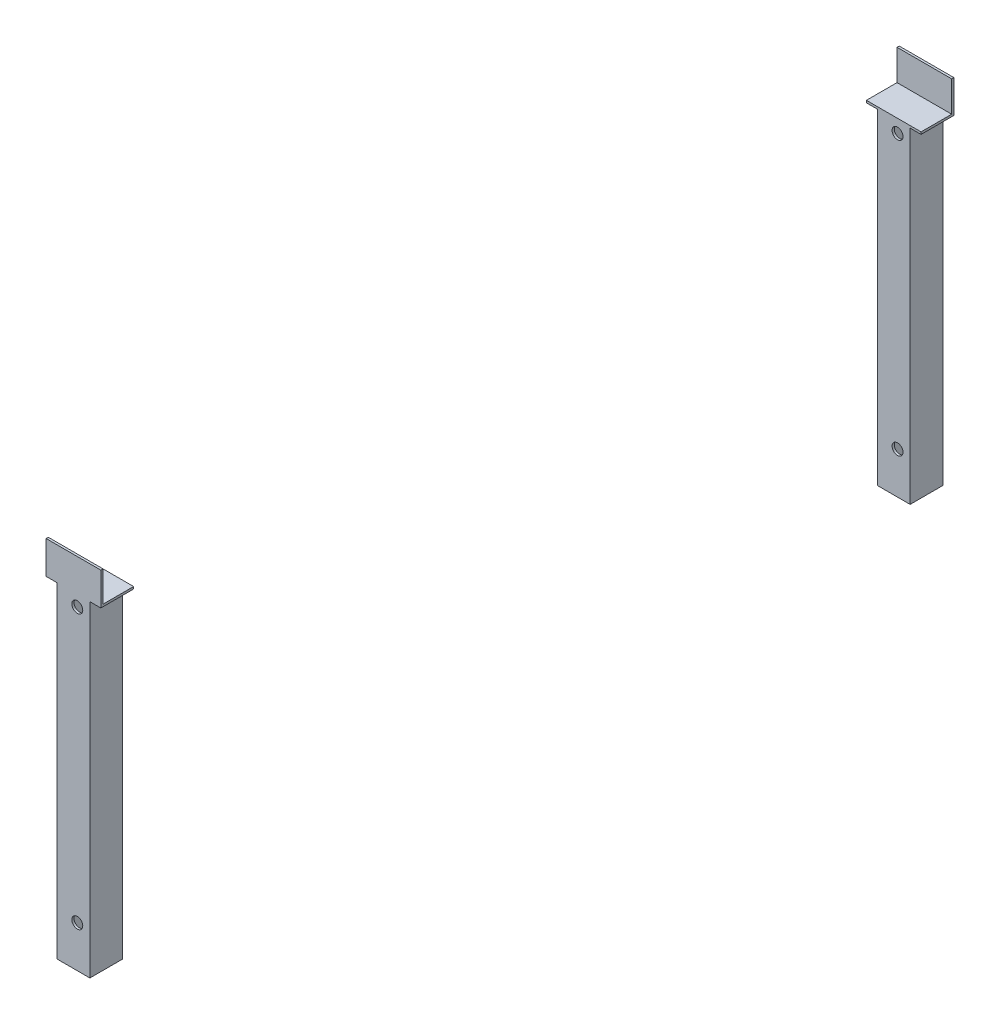
ISO-10303-21;
HEADER;
FILE_DESCRIPTION(('STEP AP214'),'2;1');
FILE_NAME('part.step','',(''),(''),'','','');
FILE_SCHEMA(('AUTOMOTIVE_DESIGN { 1 0 10303 214 1 1 1 1 }'));
ENDSEC;
DATA;
#1=APPLICATION_CONTEXT('core data for automotive mechanical design processes');
#2=APPLICATION_PROTOCOL_DEFINITION('international standard','automotive_design',2000,#1);
#3=PRODUCT_CONTEXT('',#1,'mechanical');
#4=PRODUCT('Part','Part','',(#3));
#5=PRODUCT_RELATED_PRODUCT_CATEGORY('part','',(#4));
#6=PRODUCT_DEFINITION_FORMATION('','',#4);
#7=PRODUCT_DEFINITION_CONTEXT('part definition',#1,'design');
#8=PRODUCT_DEFINITION('design','',#6,#7);
#9=PRODUCT_DEFINITION_SHAPE('','',#8);
#10=(LENGTH_UNIT() NAMED_UNIT(*) SI_UNIT(.MILLI.,.METRE.));
#11=(NAMED_UNIT(*) PLANE_ANGLE_UNIT() SI_UNIT($,.RADIAN.));
#12=(NAMED_UNIT(*) SI_UNIT($,.STERADIAN.) SOLID_ANGLE_UNIT());
#13=UNCERTAINTY_MEASURE_WITH_UNIT(LENGTH_MEASURE(1.E-05),#10,'distance_accuracy_value','');
#14=(GEOMETRIC_REPRESENTATION_CONTEXT(3) GLOBAL_UNCERTAINTY_ASSIGNED_CONTEXT((#13)) GLOBAL_UNIT_ASSIGNED_CONTEXT((#10,
#11,#12)) REPRESENTATION_CONTEXT('',''));
#15=CARTESIAN_POINT('',(0.,0.,0.));
#16=DIRECTION('',(0.,0.,1.));
#17=DIRECTION('',(1.,0.,0.));
#18=AXIS2_PLACEMENT_3D('',#15,#16,#17);
#19=CARTESIAN_POINT('',(15.,298.,-735.));
#20=DIRECTION('',(-1.,0.,0.));
#21=DIRECTION('',(0.,0.,-1.));
#22=AXIS2_PLACEMENT_3D('',#19,#20,#21);
#23=PLANE('',#22);
#24=DIRECTION('',(0.,0.,1.));
#25=VECTOR('',#24,1.);
#26=CARTESIAN_POINT('',(15.,0.,-735.));
#27=LINE('',#26,#25);
#28=CARTESIAN_POINT('',(15.,0.,-765.));
#29=VERTEX_POINT('',#28);
#30=CARTESIAN_POINT('',(15.,0.,-735.));
#31=VERTEX_POINT('',#30);
#32=EDGE_CURVE('E200',#29,#31,#27,.T.);
#33=ORIENTED_EDGE('',*,*,#32,.F.);
#34=DIRECTION('',(0.,-1.,0.));
#35=VECTOR('',#34,1.);
#36=CARTESIAN_POINT('',(15.,298.,-765.));
#37=LINE('',#36,#35);
#38=CARTESIAN_POINT('',(15.,298.,-765.));
#39=VERTEX_POINT('',#38);
#40=EDGE_CURVE('E232',#39,#29,#37,.T.);
#41=ORIENTED_EDGE('',*,*,#40,.F.);
#42=DIRECTION('',(0.,0.,1.));
#43=VECTOR('',#42,1.);
#44=CARTESIAN_POINT('',(15.,298.,-735.));
#45=LINE('',#44,#43);
#46=CARTESIAN_POINT('',(15.,298.,-735.));
#47=VERTEX_POINT('',#46);
#48=EDGE_CURVE('E226',#39,#47,#45,.T.);
#49=ORIENTED_EDGE('',*,*,#48,.T.);
#50=DIRECTION('',(0.,-1.,0.));
#51=VECTOR('',#50,1.);
#52=CARTESIAN_POINT('',(15.,298.,-735.));
#53=LINE('',#52,#51);
#54=EDGE_CURVE('E12',#47,#31,#53,.T.);
#55=ORIENTED_EDGE('',*,*,#54,.T.);
#56=EDGE_LOOP('',(#33,#41,#49,#55));
#57=FACE_BOUND('',#56,.T.);
#58=ADVANCED_FACE('F43',(#57),#23,.F.);
#59=CARTESIAN_POINT('',(-15.,298.,-735.));
#60=DIRECTION('',(0.,0.,-1.));
#61=DIRECTION('',(1.,0.,0.));
#62=AXIS2_PLACEMENT_3D('',#59,#60,#61);
#63=PLANE('',#62);
#64=CARTESIAN_POINT('',(3.5,288.,-735.));
#65=DIRECTION('',(0.,0.,1.));
#66=DIRECTION('',(1.,0.,0.));
#67=AXIS2_PLACEMENT_3D('',#64,#65,#66);
#68=CIRCLE('',#67,5.00000000000001);
#69=CARTESIAN_POINT('',(8.50000000000001,288.,-735.));
#70=VERTEX_POINT('',#69);
#71=EDGE_CURVE('E248',#70,#70,#68,.T.);
#72=ORIENTED_EDGE('',*,*,#71,.F.);
#73=EDGE_LOOP('',(#72));
#74=FACE_BOUND('',#73,.T.);
#75=CARTESIAN_POINT('',(3.50000000000004,38.,-735.));
#76=DIRECTION('',(0.,0.,1.));
#77=DIRECTION('',(1.,0.,0.));
#78=AXIS2_PLACEMENT_3D('',#75,#76,#77);
#79=CIRCLE('',#78,4.99999999999999);
#80=CARTESIAN_POINT('',(8.50000000000003,38.,-735.));
#81=VERTEX_POINT('',#80);
#82=EDGE_CURVE('E259',#81,#81,#79,.T.);
#83=ORIENTED_EDGE('',*,*,#82,.F.);
#84=EDGE_LOOP('',(#83));
#85=FACE_BOUND('',#84,.T.);
#86=DIRECTION('',(-1.,0.,0.));
#87=VECTOR('',#86,1.);
#88=CARTESIAN_POINT('',(-15.,0.,-735.));
#89=LINE('',#88,#87);
#90=CARTESIAN_POINT('',(-15.,0.,-735.));
#91=VERTEX_POINT('',#90);
#92=EDGE_CURVE('E234',#31,#91,#89,.T.);
#93=ORIENTED_EDGE('',*,*,#92,.F.);
#94=ORIENTED_EDGE('',*,*,#54,.F.);
#95=DIRECTION('',(-1.,0.,0.));
#96=VECTOR('',#95,1.);
#97=CARTESIAN_POINT('',(25.,298.,-735.));
#98=LINE('',#97,#96);
#99=CARTESIAN_POINT('',(25.,298.,-735.));
#100=VERTEX_POINT('',#99);
#101=EDGE_CURVE('E157',#100,#47,#98,.T.);
#102=ORIENTED_EDGE('',*,*,#101,.F.);
#103=DIRECTION('',(0.,-1.,0.));
#104=VECTOR('',#103,1.);
#105=CARTESIAN_POINT('',(25.,300.,-735.));
#106=LINE('',#105,#104);
#107=CARTESIAN_POINT('',(25.,300.,-735.));
#108=VERTEX_POINT('',#107);
#109=EDGE_CURVE('E178',#108,#100,#106,.T.);
#110=ORIENTED_EDGE('',*,*,#109,.F.);
#111=DIRECTION('',(-1.,0.,0.));
#112=VECTOR('',#111,1.);
#113=CARTESIAN_POINT('',(25.,300.,-735.));
#114=LINE('',#113,#112);
#115=CARTESIAN_POINT('',(-25.,300.,-735.));
#116=VERTEX_POINT('',#115);
#117=EDGE_CURVE('E162',#108,#116,#114,.T.);
#118=ORIENTED_EDGE('',*,*,#117,.T.);
#119=DIRECTION('',(0.,-1.,0.));
#120=VECTOR('',#119,1.);
#121=CARTESIAN_POINT('',(-25.,300.,-735.));
#122=LINE('',#121,#120);
#123=CARTESIAN_POINT('',(-25.,298.,-735.));
#124=VERTEX_POINT('',#123);
#125=EDGE_CURVE('E274',#116,#124,#122,.T.);
#126=ORIENTED_EDGE('',*,*,#125,.T.);
#127=CARTESIAN_POINT('',(-15.,298.,-735.));
#128=VERTEX_POINT('',#127);
#129=EDGE_CURVE('E269',#128,#124,#98,.T.);
#130=ORIENTED_EDGE('',*,*,#129,.F.);
#131=DIRECTION('',(0.,-1.,0.));
#132=VECTOR('',#131,1.);
#133=CARTESIAN_POINT('',(-15.,298.,-735.));
#134=LINE('',#133,#132);
#135=EDGE_CURVE('E51',#128,#91,#134,.T.);
#136=ORIENTED_EDGE('',*,*,#135,.T.);
#137=EDGE_LOOP('',(#93,#94,#102,#110,#118,#126,#130,#136));
#138=FACE_BOUND('',#137,.T.);
#139=ADVANCED_FACE('F282',(#74,#85,#138),#63,.F.);
#140=CARTESIAN_POINT('',(-15.,298.,-735.));
#141=DIRECTION('',(1.,0.,0.));
#142=DIRECTION('',(0.,0.,1.));
#143=AXIS2_PLACEMENT_3D('',#140,#141,#142);
#144=PLANE('',#143);
#145=DIRECTION('',(0.,0.,-1.));
#146=VECTOR('',#145,1.);
#147=CARTESIAN_POINT('',(-15.,0.,-735.));
#148=LINE('',#147,#146);
#149=CARTESIAN_POINT('',(-15.,0.,-765.));
#150=VERTEX_POINT('',#149);
#151=EDGE_CURVE('E237',#91,#150,#148,.T.);
#152=ORIENTED_EDGE('',*,*,#151,.F.);
#153=ORIENTED_EDGE('',*,*,#135,.F.);
#154=DIRECTION('',(0.,0.,-1.));
#155=VECTOR('',#154,1.);
#156=CARTESIAN_POINT('',(-15.,298.,-735.));
#157=LINE('',#156,#155);
#158=CARTESIAN_POINT('',(-15.,298.,-765.));
#159=VERTEX_POINT('',#158);
#160=EDGE_CURVE('E229',#128,#159,#157,.T.);
#161=ORIENTED_EDGE('',*,*,#160,.T.);
#162=DIRECTION('',(0.,-1.,0.));
#163=VECTOR('',#162,1.);
#164=CARTESIAN_POINT('',(-15.,298.,-765.));
#165=LINE('',#164,#163);
#166=EDGE_CURVE('E241',#159,#150,#165,.T.);
#167=ORIENTED_EDGE('',*,*,#166,.T.);
#168=EDGE_LOOP('',(#152,#153,#161,#167));
#169=FACE_BOUND('',#168,.T.);
#170=ADVANCED_FACE('F307',(#169),#144,.F.);
#171=CARTESIAN_POINT('',(-15.,298.,-765.));
#172=DIRECTION('',(0.,0.,1.));
#173=DIRECTION('',(-1.,0.,0.));
#174=AXIS2_PLACEMENT_3D('',#171,#172,#173);
#175=PLANE('',#174);
#176=CARTESIAN_POINT('',(3.5,288.,-765.));
#177=DIRECTION('',(0.,0.,1.));
#178=DIRECTION('',(1.,0.,0.));
#179=AXIS2_PLACEMENT_3D('',#176,#177,#178);
#180=CIRCLE('',#179,5.00000000000001);
#181=CARTESIAN_POINT('',(8.50000000000001,288.,-765.));
#182=VERTEX_POINT('',#181);
#183=EDGE_CURVE('E254',#182,#182,#180,.T.);
#184=ORIENTED_EDGE('',*,*,#183,.T.);
#185=EDGE_LOOP('',(#184));
#186=FACE_BOUND('',#185,.T.);
#187=CARTESIAN_POINT('',(3.50000000000004,38.,-765.));
#188=DIRECTION('',(0.,0.,1.));
#189=DIRECTION('',(1.,0.,0.));
#190=AXIS2_PLACEMENT_3D('',#187,#188,#189);
#191=CIRCLE('',#190,4.99999999999999);
#192=CARTESIAN_POINT('',(8.50000000000003,38.,-765.));
#193=VERTEX_POINT('',#192);
#194=EDGE_CURVE('E264',#193,#193,#191,.T.);
#195=ORIENTED_EDGE('',*,*,#194,.T.);
#196=EDGE_LOOP('',(#195));
#197=FACE_BOUND('',#196,.T.);
#198=DIRECTION('',(1.,0.,0.));
#199=VECTOR('',#198,1.);
#200=CARTESIAN_POINT('',(-15.,0.,-765.));
#201=LINE('',#200,#199);
#202=EDGE_CURVE('E67',#150,#29,#201,.T.);
#203=ORIENTED_EDGE('',*,*,#202,.F.);
#204=ORIENTED_EDGE('',*,*,#166,.F.);
#205=DIRECTION('',(1.,0.,0.));
#206=VECTOR('',#205,1.);
#207=CARTESIAN_POINT('',(-15.,298.,-765.));
#208=LINE('',#207,#206);
#209=CARTESIAN_POINT('',(-25.,298.,-765.));
#210=VERTEX_POINT('',#209);
#211=EDGE_CURVE('E172',#210,#159,#208,.T.);
#212=ORIENTED_EDGE('',*,*,#211,.F.);
#213=DIRECTION('',(0.,-1.,0.));
#214=VECTOR('',#213,1.);
#215=CARTESIAN_POINT('',(-25.,298.,-765.));
#216=LINE('',#215,#214);
#217=CARTESIAN_POINT('',(-25.,328.,-765.));
#218=VERTEX_POINT('',#217);
#219=EDGE_CURVE('E188',#218,#210,#216,.T.);
#220=ORIENTED_EDGE('',*,*,#219,.F.);
#221=DIRECTION('',(-1.,0.,0.));
#222=VECTOR('',#221,1.);
#223=CARTESIAN_POINT('',(-25.,328.,-765.));
#224=LINE('',#223,#222);
#225=CARTESIAN_POINT('',(25.,328.,-765.));
#226=VERTEX_POINT('',#225);
#227=EDGE_CURVE('E185',#226,#218,#224,.T.);
#228=ORIENTED_EDGE('',*,*,#227,.F.);
#229=DIRECTION('',(0.,1.,0.));
#230=VECTOR('',#229,1.);
#231=CARTESIAN_POINT('',(25.,328.,-765.));
#232=LINE('',#231,#230);
#233=CARTESIAN_POINT('',(25.,298.,-765.));
#234=VERTEX_POINT('',#233);
#235=EDGE_CURVE('E183',#234,#226,#232,.T.);
#236=ORIENTED_EDGE('',*,*,#235,.F.);
#237=EDGE_CURVE('E175',#39,#234,#208,.T.);
#238=ORIENTED_EDGE('',*,*,#237,.F.);
#239=ORIENTED_EDGE('',*,*,#40,.T.);
#240=EDGE_LOOP('',(#203,#204,#212,#220,#228,#236,#238,#239));
#241=FACE_BOUND('',#240,.T.);
#242=ADVANCED_FACE('F290',(#186,#197,#241),#175,.F.);
#243=CARTESIAN_POINT('',(0.,0.,-750.));
#244=DIRECTION('',(0.,1.,0.));
#245=DIRECTION('',(0.,0.,-1.));
#246=AXIS2_PLACEMENT_3D('',#243,#244,#245);
#247=PLANE('',#246);
#248=DIRECTION('',(1.,0.,0.));
#249=VECTOR('',#248,1.);
#250=CARTESIAN_POINT('',(-15.,0.,-763.));
#251=LINE('',#250,#249);
#252=CARTESIAN_POINT('',(-13.,0.,-763.));
#253=VERTEX_POINT('',#252);
#254=CARTESIAN_POINT('',(13.,0.,-763.));
#255=VERTEX_POINT('',#254);
#256=EDGE_CURVE('E205',#253,#255,#251,.T.);
#257=ORIENTED_EDGE('',*,*,#256,.F.);
#258=DIRECTION('',(0.,0.,-1.));
#259=VECTOR('',#258,1.);
#260=CARTESIAN_POINT('',(-13.,0.,-735.));
#261=LINE('',#260,#259);
#262=CARTESIAN_POINT('',(-13.,0.,-737.));
#263=VERTEX_POINT('',#262);
#264=EDGE_CURVE('E223',#263,#253,#261,.T.);
#265=ORIENTED_EDGE('',*,*,#264,.F.);
#266=DIRECTION('',(-1.,0.,0.));
#267=VECTOR('',#266,1.);
#268=CARTESIAN_POINT('',(-15.,0.,-737.));
#269=LINE('',#268,#267);
#270=CARTESIAN_POINT('',(13.,0.,-737.));
#271=VERTEX_POINT('',#270);
#272=EDGE_CURVE('E220',#271,#263,#269,.T.);
#273=ORIENTED_EDGE('',*,*,#272,.F.);
#274=DIRECTION('',(0.,0.,1.));
#275=VECTOR('',#274,1.);
#276=CARTESIAN_POINT('',(13.,0.,-735.));
#277=LINE('',#276,#275);
#278=EDGE_CURVE('E193',#255,#271,#277,.T.);
#279=ORIENTED_EDGE('',*,*,#278,.F.);
#280=EDGE_LOOP('',(#257,#265,#273,#279));
#281=FACE_BOUND('',#280,.T.);
#282=ORIENTED_EDGE('',*,*,#32,.T.);
#283=ORIENTED_EDGE('',*,*,#92,.T.);
#284=ORIENTED_EDGE('',*,*,#151,.T.);
#285=ORIENTED_EDGE('',*,*,#202,.T.);
#286=EDGE_LOOP('',(#282,#283,#284,#285));
#287=FACE_BOUND('',#286,.T.);
#288=ADVANCED_FACE('F303',(#281,#287),#247,.F.);
#289=CARTESIAN_POINT('',(13.,298.,-735.));
#290=DIRECTION('',(-1.,0.,0.));
#291=DIRECTION('',(0.,0.,-1.));
#292=AXIS2_PLACEMENT_3D('',#289,#290,#291);
#293=PLANE('',#292);
#294=ORIENTED_EDGE('',*,*,#278,.T.);
#295=DIRECTION('',(0.,-1.,0.));
#296=VECTOR('',#295,1.);
#297=CARTESIAN_POINT('',(13.,298.,-737.));
#298=LINE('',#297,#296);
#299=CARTESIAN_POINT('',(13.,296.,-737.));
#300=VERTEX_POINT('',#299);
#301=EDGE_CURVE('E198',#300,#271,#298,.T.);
#302=ORIENTED_EDGE('',*,*,#301,.F.);
#303=DIRECTION('',(0.,0.,1.));
#304=VECTOR('',#303,1.);
#305=CARTESIAN_POINT('',(13.,296.,-735.));
#306=LINE('',#305,#304);
#307=CARTESIAN_POINT('',(13.,296.,-763.));
#308=VERTEX_POINT('',#307);
#309=EDGE_CURVE('E201',#308,#300,#306,.T.);
#310=ORIENTED_EDGE('',*,*,#309,.F.);
#311=DIRECTION('',(0.,-1.,0.));
#312=VECTOR('',#311,1.);
#313=CARTESIAN_POINT('',(13.,298.,-763.));
#314=LINE('',#313,#312);
#315=EDGE_CURVE('E206',#308,#255,#314,.T.);
#316=ORIENTED_EDGE('',*,*,#315,.T.);
#317=EDGE_LOOP('',(#294,#302,#310,#316));
#318=FACE_BOUND('',#317,.T.);
#319=ADVANCED_FACE('F345',(#318),#293,.T.);
#320=CARTESIAN_POINT('',(-15.,298.,-737.));
#321=DIRECTION('',(0.,0.,-1.));
#322=DIRECTION('',(1.,0.,0.));
#323=AXIS2_PLACEMENT_3D('',#320,#321,#322);
#324=PLANE('',#323);
#325=CARTESIAN_POINT('',(3.5,288.,-737.));
#326=DIRECTION('',(0.,0.,1.));
#327=DIRECTION('',(1.,0.,0.));
#328=AXIS2_PLACEMENT_3D('',#325,#326,#327);
#329=CIRCLE('',#328,5.00000000000001);
#330=CARTESIAN_POINT('',(8.50000000000001,288.,-737.));
#331=VERTEX_POINT('',#330);
#332=EDGE_CURVE('E267',#331,#331,#329,.T.);
#333=ORIENTED_EDGE('',*,*,#332,.T.);
#334=EDGE_LOOP('',(#333));
#335=FACE_BOUND('',#334,.T.);
#336=CARTESIAN_POINT('',(3.50000000000004,38.,-737.));
#337=DIRECTION('',(0.,0.,1.));
#338=DIRECTION('',(1.,0.,0.));
#339=AXIS2_PLACEMENT_3D('',#336,#337,#338);
#340=CIRCLE('',#339,4.99999999999999);
#341=CARTESIAN_POINT('',(8.50000000000003,38.,-737.));
#342=VERTEX_POINT('',#341);
#343=EDGE_CURVE('E247',#342,#342,#340,.T.);
#344=ORIENTED_EDGE('',*,*,#343,.T.);
#345=EDGE_LOOP('',(#344));
#346=FACE_BOUND('',#345,.T.);
#347=ORIENTED_EDGE('',*,*,#272,.T.);
#348=DIRECTION('',(0.,-1.,0.));
#349=VECTOR('',#348,1.);
#350=CARTESIAN_POINT('',(-13.,298.,-737.));
#351=LINE('',#350,#349);
#352=CARTESIAN_POINT('',(-13.,296.,-737.));
#353=VERTEX_POINT('',#352);
#354=EDGE_CURVE('E59',#353,#263,#351,.T.);
#355=ORIENTED_EDGE('',*,*,#354,.F.);
#356=DIRECTION('',(-1.,0.,0.));
#357=VECTOR('',#356,1.);
#358=CARTESIAN_POINT('',(-15.,296.,-737.));
#359=LINE('',#358,#357);
#360=EDGE_CURVE('E204',#300,#353,#359,.T.);
#361=ORIENTED_EDGE('',*,*,#360,.F.);
#362=ORIENTED_EDGE('',*,*,#301,.T.);
#363=EDGE_LOOP('',(#347,#355,#361,#362));
#364=FACE_BOUND('',#363,.T.);
#365=ADVANCED_FACE('F355',(#335,#346,#364),#324,.T.);
#366=CARTESIAN_POINT('',(-13.,298.,-735.));
#367=DIRECTION('',(1.,0.,0.));
#368=DIRECTION('',(0.,0.,1.));
#369=AXIS2_PLACEMENT_3D('',#366,#367,#368);
#370=PLANE('',#369);
#371=ORIENTED_EDGE('',*,*,#264,.T.);
#372=DIRECTION('',(0.,-1.,0.));
#373=VECTOR('',#372,1.);
#374=CARTESIAN_POINT('',(-13.,298.,-763.));
#375=LINE('',#374,#373);
#376=CARTESIAN_POINT('',(-13.,296.,-763.));
#377=VERTEX_POINT('',#376);
#378=EDGE_CURVE('E208',#377,#253,#375,.T.);
#379=ORIENTED_EDGE('',*,*,#378,.F.);
#380=DIRECTION('',(0.,0.,-1.));
#381=VECTOR('',#380,1.);
#382=CARTESIAN_POINT('',(-13.,296.,-735.));
#383=LINE('',#382,#381);
#384=EDGE_CURVE('E213',#353,#377,#383,.T.);
#385=ORIENTED_EDGE('',*,*,#384,.F.);
#386=ORIENTED_EDGE('',*,*,#354,.T.);
#387=EDGE_LOOP('',(#371,#379,#385,#386));
#388=FACE_BOUND('',#387,.T.);
#389=ADVANCED_FACE('F365',(#388),#370,.T.);
#390=CARTESIAN_POINT('',(-15.,298.,-763.));
#391=DIRECTION('',(0.,0.,1.));
#392=DIRECTION('',(-1.,0.,0.));
#393=AXIS2_PLACEMENT_3D('',#390,#391,#392);
#394=PLANE('',#393);
#395=CARTESIAN_POINT('',(3.5,288.,-763.));
#396=DIRECTION('',(0.,0.,-1.));
#397=DIRECTION('',(-1.,0.,0.));
#398=AXIS2_PLACEMENT_3D('',#395,#396,#397);
#399=CIRCLE('',#398,5.00000000000001);
#400=CARTESIAN_POINT('',(-1.5,288.,-763.));
#401=VERTEX_POINT('',#400);
#402=EDGE_CURVE('E46',#401,#401,#399,.T.);
#403=ORIENTED_EDGE('',*,*,#402,.T.);
#404=EDGE_LOOP('',(#403));
#405=FACE_BOUND('',#404,.T.);
#406=CARTESIAN_POINT('',(3.50000000000004,38.,-763.));
#407=DIRECTION('',(0.,0.,-1.));
#408=DIRECTION('',(-1.,0.,0.));
#409=AXIS2_PLACEMENT_3D('',#406,#407,#408);
#410=CIRCLE('',#409,4.99999999999999);
#411=CARTESIAN_POINT('',(-1.49999999999996,38.,-763.));
#412=VERTEX_POINT('',#411);
#413=EDGE_CURVE('E245',#412,#412,#410,.T.);
#414=ORIENTED_EDGE('',*,*,#413,.T.);
#415=EDGE_LOOP('',(#414));
#416=FACE_BOUND('',#415,.T.);
#417=ORIENTED_EDGE('',*,*,#256,.T.);
#418=ORIENTED_EDGE('',*,*,#315,.F.);
#419=DIRECTION('',(1.,0.,0.));
#420=VECTOR('',#419,1.);
#421=CARTESIAN_POINT('',(-15.,296.,-763.));
#422=LINE('',#421,#420);
#423=EDGE_CURVE('E209',#377,#308,#422,.T.);
#424=ORIENTED_EDGE('',*,*,#423,.F.);
#425=ORIENTED_EDGE('',*,*,#378,.T.);
#426=EDGE_LOOP('',(#417,#418,#424,#425));
#427=FACE_BOUND('',#426,.T.);
#428=ADVANCED_FACE('F375',(#405,#416,#427),#394,.T.);
#429=CARTESIAN_POINT('',(0.,296.,-750.));
#430=DIRECTION('',(0.,1.,0.));
#431=DIRECTION('',(0.,0.,-1.));
#432=AXIS2_PLACEMENT_3D('',#429,#430,#431);
#433=PLANE('',#432);
#434=ORIENTED_EDGE('',*,*,#309,.T.);
#435=ORIENTED_EDGE('',*,*,#360,.T.);
#436=ORIENTED_EDGE('',*,*,#384,.T.);
#437=ORIENTED_EDGE('',*,*,#423,.T.);
#438=EDGE_LOOP('',(#434,#435,#436,#437));
#439=FACE_BOUND('',#438,.T.);
#440=ADVANCED_FACE('F384',(#439),#433,.F.);
#441=CARTESIAN_POINT('',(-15.,298.,-763.));
#442=DIRECTION('',(0.,-1.,0.));
#443=DIRECTION('',(0.,0.,1.));
#444=AXIS2_PLACEMENT_3D('',#441,#442,#443);
#445=PLANE('',#444);
#446=ORIENTED_EDGE('',*,*,#237,.T.);
#447=DIRECTION('',(0.,0.,-1.));
#448=VECTOR('',#447,1.);
#449=CARTESIAN_POINT('',(25.,298.,-763.));
#450=LINE('',#449,#448);
#451=EDGE_CURVE('E182',#100,#234,#450,.T.);
#452=ORIENTED_EDGE('',*,*,#451,.F.);
#453=ORIENTED_EDGE('',*,*,#101,.T.);
#454=ORIENTED_EDGE('',*,*,#48,.F.);
#455=EDGE_LOOP('',(#446,#452,#453,#454));
#456=FACE_BOUND('',#455,.T.);
#457=ADVANCED_FACE('F285',(#456),#445,.T.);
#458=DIRECTION('',(0.,0.,-1.));
#459=VECTOR('',#458,1.);
#460=CARTESIAN_POINT('',(-25.,298.,-763.));
#461=LINE('',#460,#459);
#462=EDGE_CURVE('E191',#124,#210,#461,.T.);
#463=ORIENTED_EDGE('',*,*,#462,.T.);
#464=ORIENTED_EDGE('',*,*,#211,.T.);
#465=ORIENTED_EDGE('',*,*,#160,.F.);
#466=ORIENTED_EDGE('',*,*,#129,.T.);
#467=EDGE_LOOP('',(#463,#464,#465,#466));
#468=FACE_BOUND('',#467,.T.);
#469=ADVANCED_FACE('F300',(#468),#445,.T.);
#470=CARTESIAN_POINT('',(-25.,298.,-763.));
#471=DIRECTION('',(-1.,0.,0.));
#472=DIRECTION('',(0.,0.,-1.));
#473=AXIS2_PLACEMENT_3D('',#470,#471,#472);
#474=PLANE('',#473);
#475=ORIENTED_EDGE('',*,*,#219,.T.);
#476=ORIENTED_EDGE('',*,*,#462,.F.);
#477=ORIENTED_EDGE('',*,*,#125,.F.);
#478=DIRECTION('',(0.,0.,-1.));
#479=VECTOR('',#478,1.);
#480=CARTESIAN_POINT('',(-25.,300.,-763.));
#481=LINE('',#480,#479);
#482=CARTESIAN_POINT('',(-25.,300.,-763.));
#483=VERTEX_POINT('',#482);
#484=EDGE_CURVE('E272',#116,#483,#481,.T.);
#485=ORIENTED_EDGE('',*,*,#484,.T.);
#486=DIRECTION('',(0.,-1.,0.));
#487=VECTOR('',#486,1.);
#488=CARTESIAN_POINT('',(-25.,298.,-763.));
#489=LINE('',#488,#487);
#490=CARTESIAN_POINT('',(-25.,328.,-763.));
#491=VERTEX_POINT('',#490);
#492=EDGE_CURVE('E153',#491,#483,#489,.T.);
#493=ORIENTED_EDGE('',*,*,#492,.F.);
#494=DIRECTION('',(0.,0.,-1.));
#495=VECTOR('',#494,1.);
#496=CARTESIAN_POINT('',(-25.,328.,-763.));
#497=LINE('',#496,#495);
#498=EDGE_CURVE('E194',#491,#218,#497,.T.);
#499=ORIENTED_EDGE('',*,*,#498,.T.);
#500=EDGE_LOOP('',(#475,#476,#477,#485,#493,#499));
#501=FACE_BOUND('',#500,.T.);
#502=ADVANCED_FACE('F297',(#501),#474,.T.);
#503=CARTESIAN_POINT('',(-25.,328.,-763.));
#504=DIRECTION('',(0.,1.,0.));
#505=DIRECTION('',(0.,0.,-1.));
#506=AXIS2_PLACEMENT_3D('',#503,#504,#505);
#507=PLANE('',#506);
#508=ORIENTED_EDGE('',*,*,#227,.T.);
#509=ORIENTED_EDGE('',*,*,#498,.F.);
#510=DIRECTION('',(-1.,0.,0.));
#511=VECTOR('',#510,1.);
#512=CARTESIAN_POINT('',(-25.,328.,-763.));
#513=LINE('',#512,#511);
#514=CARTESIAN_POINT('',(25.,328.,-763.));
#515=VERTEX_POINT('',#514);
#516=EDGE_CURVE('E171',#515,#491,#513,.T.);
#517=ORIENTED_EDGE('',*,*,#516,.F.);
#518=DIRECTION('',(0.,0.,-1.));
#519=VECTOR('',#518,1.);
#520=CARTESIAN_POINT('',(25.,328.,-763.));
#521=LINE('',#520,#519);
#522=EDGE_CURVE('E169',#515,#226,#521,.T.);
#523=ORIENTED_EDGE('',*,*,#522,.T.);
#524=EDGE_LOOP('',(#508,#509,#517,#523));
#525=FACE_BOUND('',#524,.T.);
#526=ADVANCED_FACE('F295',(#525),#507,.T.);
#527=CARTESIAN_POINT('',(25.,328.,-763.));
#528=DIRECTION('',(1.,0.,0.));
#529=DIRECTION('',(0.,1.,0.));
#530=AXIS2_PLACEMENT_3D('',#527,#528,#529);
#531=PLANE('',#530);
#532=ORIENTED_EDGE('',*,*,#235,.T.);
#533=ORIENTED_EDGE('',*,*,#522,.F.);
#534=DIRECTION('',(0.,1.,0.));
#535=VECTOR('',#534,1.);
#536=CARTESIAN_POINT('',(25.,328.,-763.));
#537=LINE('',#536,#535);
#538=CARTESIAN_POINT('',(25.,300.,-763.));
#539=VERTEX_POINT('',#538);
#540=EDGE_CURVE('E150',#539,#515,#537,.T.);
#541=ORIENTED_EDGE('',*,*,#540,.F.);
#542=DIRECTION('',(0.,0.,1.));
#543=VECTOR('',#542,1.);
#544=CARTESIAN_POINT('',(25.,300.,-763.));
#545=LINE('',#544,#543);
#546=EDGE_CURVE('E156',#539,#108,#545,.T.);
#547=ORIENTED_EDGE('',*,*,#546,.T.);
#548=ORIENTED_EDGE('',*,*,#109,.T.);
#549=ORIENTED_EDGE('',*,*,#451,.T.);
#550=EDGE_LOOP('',(#532,#533,#541,#547,#548,#549));
#551=FACE_BOUND('',#550,.T.);
#552=ADVANCED_FACE('F168',(#551),#531,.T.);
#553=CARTESIAN_POINT('',(0.,0.,-763.));
#554=DIRECTION('',(0.,0.,1.));
#555=DIRECTION('',(-1.,0.,0.));
#556=AXIS2_PLACEMENT_3D('',#553,#554,#555);
#557=PLANE('',#556);
#558=DIRECTION('',(1.,0.,0.));
#559=VECTOR('',#558,1.);
#560=CARTESIAN_POINT('',(-15.,300.,-763.));
#561=LINE('',#560,#559);
#562=EDGE_CURVE('E146',#483,#539,#561,.T.);
#563=ORIENTED_EDGE('',*,*,#562,.T.);
#564=ORIENTED_EDGE('',*,*,#540,.T.);
#565=ORIENTED_EDGE('',*,*,#516,.T.);
#566=ORIENTED_EDGE('',*,*,#492,.T.);
#567=EDGE_LOOP('',(#563,#564,#565,#566));
#568=FACE_BOUND('',#567,.T.);
#569=ADVANCED_FACE('F148',(#568),#557,.T.);
#570=CARTESIAN_POINT('',(0.,300.,-750.));
#571=DIRECTION('',(0.,1.,0.));
#572=DIRECTION('',(0.,0.,-1.));
#573=AXIS2_PLACEMENT_3D('',#570,#571,#572);
#574=PLANE('',#573);
#575=ORIENTED_EDGE('',*,*,#562,.F.);
#576=ORIENTED_EDGE('',*,*,#484,.F.);
#577=ORIENTED_EDGE('',*,*,#117,.F.);
#578=ORIENTED_EDGE('',*,*,#546,.F.);
#579=EDGE_LOOP('',(#575,#576,#577,#578));
#580=FACE_BOUND('',#579,.T.);
#581=ADVANCED_FACE('F160',(#580),#574,.T.);
#582=CARTESIAN_POINT('',(3.50000000000004,38.,-735.));
#583=DIRECTION('',(0.,0.,-1.));
#584=DIRECTION('',(1.,0.,0.));
#585=AXIS2_PLACEMENT_3D('',#582,#583,#584);
#586=CYLINDRICAL_SURFACE('',#585,4.99999999999999);
#587=ORIENTED_EDGE('',*,*,#413,.F.);
#588=EDGE_LOOP('',(#587));
#589=FACE_BOUND('',#588,.T.);
#590=ORIENTED_EDGE('',*,*,#194,.F.);
#591=EDGE_LOOP('',(#590));
#592=FACE_BOUND('',#591,.T.);
#593=ADVANCED_FACE('F456',(#589,#592),#586,.F.);
#594=CARTESIAN_POINT('',(3.5,288.,-735.));
#595=DIRECTION('',(0.,0.,-1.));
#596=DIRECTION('',(1.,0.,0.));
#597=AXIS2_PLACEMENT_3D('',#594,#595,#596);
#598=CYLINDRICAL_SURFACE('',#597,5.00000000000001);
#599=ORIENTED_EDGE('',*,*,#402,.F.);
#600=EDGE_LOOP('',(#599));
#601=FACE_BOUND('',#600,.T.);
#602=ORIENTED_EDGE('',*,*,#183,.F.);
#603=EDGE_LOOP('',(#602));
#604=FACE_BOUND('',#603,.T.);
#605=ADVANCED_FACE('F465',(#601,#604),#598,.F.);
#606=ORIENTED_EDGE('',*,*,#343,.F.);
#607=EDGE_LOOP('',(#606));
#608=FACE_BOUND('',#607,.T.);
#609=ORIENTED_EDGE('',*,*,#82,.T.);
#610=EDGE_LOOP('',(#609));
#611=FACE_BOUND('',#610,.T.);
#612=ADVANCED_FACE('F468',(#608,#611),#586,.F.);
#613=ORIENTED_EDGE('',*,*,#332,.F.);
#614=EDGE_LOOP('',(#613));
#615=FACE_BOUND('',#614,.T.);
#616=ORIENTED_EDGE('',*,*,#71,.T.);
#617=EDGE_LOOP('',(#616));
#618=FACE_BOUND('',#617,.T.);
#619=ADVANCED_FACE('F478',(#615,#618),#598,.F.);
#620=CLOSED_SHELL('',(#58,#139,#170,#242,#288,#319,#365,#389,#428,#440,#457,#469,#502,#526,#552,
#569,#581,#593,#605,#612,#619));
#621=MANIFOLD_SOLID_BREP('B2',#620);
#622=CARTESIAN_POINT('',(15.,298.,-15.));
#623=DIRECTION('',(-1.,0.,0.));
#624=DIRECTION('',(0.,0.,1.));
#625=AXIS2_PLACEMENT_3D('',#622,#623,#624);
#626=PLANE('',#625);
#627=DIRECTION('',(0.,0.,-1.));
#628=VECTOR('',#627,1.);
#629=CARTESIAN_POINT('',(15.,0.,-15.));
#630=LINE('',#629,#628);
#631=CARTESIAN_POINT('',(15.,0.,15.));
#632=VERTEX_POINT('',#631);
#633=CARTESIAN_POINT('',(15.,0.,-15.));
#634=VERTEX_POINT('',#633);
#635=EDGE_CURVE('E711',#632,#634,#630,.T.);
#636=ORIENTED_EDGE('',*,*,#635,.T.);
#637=DIRECTION('',(0.,-1.,0.));
#638=VECTOR('',#637,1.);
#639=CARTESIAN_POINT('',(15.,298.,-15.));
#640=LINE('',#639,#638);
#641=CARTESIAN_POINT('',(15.,298.,-15.));
#642=VERTEX_POINT('',#641);
#643=EDGE_CURVE('E41',#642,#634,#640,.T.);
#644=ORIENTED_EDGE('',*,*,#643,.F.);
#645=DIRECTION('',(0.,0.,-1.));
#646=VECTOR('',#645,1.);
#647=CARTESIAN_POINT('',(15.,298.,-15.));
#648=LINE('',#647,#646);
#649=CARTESIAN_POINT('',(15.,298.,15.));
#650=VERTEX_POINT('',#649);
#651=EDGE_CURVE('E736',#650,#642,#648,.T.);
#652=ORIENTED_EDGE('',*,*,#651,.F.);
#653=DIRECTION('',(0.,-1.,0.));
#654=VECTOR('',#653,1.);
#655=CARTESIAN_POINT('',(15.,298.,15.));
#656=LINE('',#655,#654);
#657=EDGE_CURVE('E740',#650,#632,#656,.T.);
#658=ORIENTED_EDGE('',*,*,#657,.T.);
#659=EDGE_LOOP('',(#636,#644,#652,#658));
#660=FACE_BOUND('',#659,.T.);
#661=ADVANCED_FACE('F547',(#660),#626,.F.);
#662=CARTESIAN_POINT('',(-15.,298.,-15.));
#663=DIRECTION('',(0.,0.,1.));
#664=DIRECTION('',(1.,0.,0.));
#665=AXIS2_PLACEMENT_3D('',#662,#663,#664);
#666=PLANE('',#665);
#667=CARTESIAN_POINT('',(3.5,288.,-15.));
#668=DIRECTION('',(0.,0.,1.));
#669=DIRECTION('',(1.,0.,0.));
#670=AXIS2_PLACEMENT_3D('',#667,#668,#669);
#671=CIRCLE('',#670,5.00000000000001);
#672=CARTESIAN_POINT('',(8.50000000000001,288.,-15.));
#673=VERTEX_POINT('',#672);
#674=EDGE_CURVE('E755',#673,#673,#671,.T.);
#675=ORIENTED_EDGE('',*,*,#674,.T.);
#676=EDGE_LOOP('',(#675));
#677=FACE_BOUND('',#676,.T.);
#678=CARTESIAN_POINT('',(3.50000000000004,38.,-15.));
#679=DIRECTION('',(0.,0.,1.));
#680=DIRECTION('',(1.,0.,0.));
#681=AXIS2_PLACEMENT_3D('',#678,#679,#680);
#682=CIRCLE('',#681,4.99999999999999);
#683=CARTESIAN_POINT('',(8.50000000000003,38.,-15.));
#684=VERTEX_POINT('',#683);
#685=EDGE_CURVE('E766',#684,#684,#682,.T.);
#686=ORIENTED_EDGE('',*,*,#685,.T.);
#687=EDGE_LOOP('',(#686));
#688=FACE_BOUND('',#687,.T.);
#689=DIRECTION('',(-1.,0.,0.));
#690=VECTOR('',#689,1.);
#691=CARTESIAN_POINT('',(-15.,0.,-15.));
#692=LINE('',#691,#690);
#693=CARTESIAN_POINT('',(-15.,0.,-15.));
#694=VERTEX_POINT('',#693);
#695=EDGE_CURVE('E743',#634,#694,#692,.T.);
#696=ORIENTED_EDGE('',*,*,#695,.T.);
#697=DIRECTION('',(0.,-1.,0.));
#698=VECTOR('',#697,1.);
#699=CARTESIAN_POINT('',(-15.,298.,-15.));
#700=LINE('',#699,#698);
#701=CARTESIAN_POINT('',(-15.,298.,-15.));
#702=VERTEX_POINT('',#701);
#703=EDGE_CURVE('E555',#702,#694,#700,.T.);
#704=ORIENTED_EDGE('',*,*,#703,.F.);
#705=DIRECTION('',(-1.,0.,0.));
#706=VECTOR('',#705,1.);
#707=CARTESIAN_POINT('',(25.,298.,-15.));
#708=LINE('',#707,#706);
#709=CARTESIAN_POINT('',(-25.,298.,-15.));
#710=VERTEX_POINT('',#709);
#711=EDGE_CURVE('E776',#702,#710,#708,.T.);
#712=ORIENTED_EDGE('',*,*,#711,.T.);
#713=DIRECTION('',(0.,-1.,0.));
#714=VECTOR('',#713,1.);
#715=CARTESIAN_POINT('',(-25.,300.,-15.));
#716=LINE('',#715,#714);
#717=CARTESIAN_POINT('',(-25.,300.,-15.));
#718=VERTEX_POINT('',#717);
#719=EDGE_CURVE('E780',#718,#710,#716,.T.);
#720=ORIENTED_EDGE('',*,*,#719,.F.);
#721=DIRECTION('',(-1.,0.,0.));
#722=VECTOR('',#721,1.);
#723=CARTESIAN_POINT('',(25.,300.,-15.));
#724=LINE('',#723,#722);
#725=CARTESIAN_POINT('',(25.,300.,-15.));
#726=VERTEX_POINT('',#725);
#727=EDGE_CURVE('E662',#726,#718,#724,.T.);
#728=ORIENTED_EDGE('',*,*,#727,.F.);
#729=DIRECTION('',(0.,-1.,0.));
#730=VECTOR('',#729,1.);
#731=CARTESIAN_POINT('',(25.,300.,-15.));
#732=LINE('',#731,#730);
#733=CARTESIAN_POINT('',(25.,298.,-15.));
#734=VERTEX_POINT('',#733);
#735=EDGE_CURVE('E659',#726,#734,#732,.T.);
#736=ORIENTED_EDGE('',*,*,#735,.T.);
#737=EDGE_CURVE('E672',#734,#642,#708,.T.);
#738=ORIENTED_EDGE('',*,*,#737,.T.);
#739=ORIENTED_EDGE('',*,*,#643,.T.);
#740=EDGE_LOOP('',(#696,#704,#712,#720,#728,#736,#738,#739));
#741=FACE_BOUND('',#740,.T.);
#742=ADVANCED_FACE('F787',(#677,#688,#741),#666,.F.);
#743=CARTESIAN_POINT('',(-15.,298.,-15.));
#744=DIRECTION('',(1.,0.,0.));
#745=DIRECTION('',(0.,0.,-1.));
#746=AXIS2_PLACEMENT_3D('',#743,#744,#745);
#747=PLANE('',#746);
#748=DIRECTION('',(0.,0.,1.));
#749=VECTOR('',#748,1.);
#750=CARTESIAN_POINT('',(-15.,0.,-15.));
#751=LINE('',#750,#749);
#752=CARTESIAN_POINT('',(-15.,0.,15.));
#753=VERTEX_POINT('',#752);
#754=EDGE_CURVE('E745',#694,#753,#751,.T.);
#755=ORIENTED_EDGE('',*,*,#754,.T.);
#756=DIRECTION('',(0.,-1.,0.));
#757=VECTOR('',#756,1.);
#758=CARTESIAN_POINT('',(-15.,298.,15.));
#759=LINE('',#758,#757);
#760=CARTESIAN_POINT('',(-15.,298.,15.));
#761=VERTEX_POINT('',#760);
#762=EDGE_CURVE('E749',#761,#753,#759,.T.);
#763=ORIENTED_EDGE('',*,*,#762,.F.);
#764=DIRECTION('',(0.,0.,1.));
#765=VECTOR('',#764,1.);
#766=CARTESIAN_POINT('',(-15.,298.,-15.));
#767=LINE('',#766,#765);
#768=EDGE_CURVE('E738',#702,#761,#767,.T.);
#769=ORIENTED_EDGE('',*,*,#768,.F.);
#770=ORIENTED_EDGE('',*,*,#703,.T.);
#771=EDGE_LOOP('',(#755,#763,#769,#770));
#772=FACE_BOUND('',#771,.T.);
#773=ADVANCED_FACE('F800',(#772),#747,.F.);
#774=CARTESIAN_POINT('',(-15.,298.,15.));
#775=DIRECTION('',(0.,0.,-1.));
#776=DIRECTION('',(-1.,0.,0.));
#777=AXIS2_PLACEMENT_3D('',#774,#775,#776);
#778=PLANE('',#777);
#779=CARTESIAN_POINT('',(3.5,288.,15.));
#780=DIRECTION('',(0.,0.,1.));
#781=DIRECTION('',(1.,0.,0.));
#782=AXIS2_PLACEMENT_3D('',#779,#780,#781);
#783=CIRCLE('',#782,5.00000000000001);
#784=CARTESIAN_POINT('',(8.50000000000001,288.,15.));
#785=VERTEX_POINT('',#784);
#786=EDGE_CURVE('E761',#785,#785,#783,.T.);
#787=ORIENTED_EDGE('',*,*,#786,.F.);
#788=EDGE_LOOP('',(#787));
#789=FACE_BOUND('',#788,.T.);
#790=CARTESIAN_POINT('',(3.50000000000004,38.,15.));
#791=DIRECTION('',(0.,0.,1.));
#792=DIRECTION('',(1.,0.,0.));
#793=AXIS2_PLACEMENT_3D('',#790,#791,#792);
#794=CIRCLE('',#793,4.99999999999999);
#795=CARTESIAN_POINT('',(8.50000000000003,38.,15.));
#796=VERTEX_POINT('',#795);
#797=EDGE_CURVE('E771',#796,#796,#794,.T.);
#798=ORIENTED_EDGE('',*,*,#797,.F.);
#799=EDGE_LOOP('',(#798));
#800=FACE_BOUND('',#799,.T.);
#801=DIRECTION('',(1.,0.,0.));
#802=VECTOR('',#801,1.);
#803=CARTESIAN_POINT('',(-15.,0.,15.));
#804=LINE('',#803,#802);
#805=EDGE_CURVE('E571',#753,#632,#804,.T.);
#806=ORIENTED_EDGE('',*,*,#805,.T.);
#807=ORIENTED_EDGE('',*,*,#657,.F.);
#808=DIRECTION('',(1.,0.,0.));
#809=VECTOR('',#808,1.);
#810=CARTESIAN_POINT('',(-15.,298.,15.));
#811=LINE('',#810,#809);
#812=CARTESIAN_POINT('',(25.,298.,15.));
#813=VERTEX_POINT('',#812);
#814=EDGE_CURVE('E683',#650,#813,#811,.T.);
#815=ORIENTED_EDGE('',*,*,#814,.T.);
#816=DIRECTION('',(0.,1.,0.));
#817=VECTOR('',#816,1.);
#818=CARTESIAN_POINT('',(25.,328.,15.));
#819=LINE('',#818,#817);
#820=CARTESIAN_POINT('',(25.,328.,15.));
#821=VERTEX_POINT('',#820);
#822=EDGE_CURVE('E690',#813,#821,#819,.T.);
#823=ORIENTED_EDGE('',*,*,#822,.T.);
#824=DIRECTION('',(-1.,0.,0.));
#825=VECTOR('',#824,1.);
#826=CARTESIAN_POINT('',(-25.,328.,15.));
#827=LINE('',#826,#825);
#828=CARTESIAN_POINT('',(-25.,328.,15.));
#829=VERTEX_POINT('',#828);
#830=EDGE_CURVE('E693',#821,#829,#827,.T.);
#831=ORIENTED_EDGE('',*,*,#830,.T.);
#832=DIRECTION('',(0.,-1.,0.));
#833=VECTOR('',#832,1.);
#834=CARTESIAN_POINT('',(-25.,298.,15.));
#835=LINE('',#834,#833);
#836=CARTESIAN_POINT('',(-25.,298.,15.));
#837=VERTEX_POINT('',#836);
#838=EDGE_CURVE('E696',#829,#837,#835,.T.);
#839=ORIENTED_EDGE('',*,*,#838,.T.);
#840=EDGE_CURVE('E678',#837,#761,#811,.T.);
#841=ORIENTED_EDGE('',*,*,#840,.T.);
#842=ORIENTED_EDGE('',*,*,#762,.T.);
#843=EDGE_LOOP('',(#806,#807,#815,#823,#831,#839,#841,#842));
#844=FACE_BOUND('',#843,.T.);
#845=ADVANCED_FACE('F805',(#789,#800,#844),#778,.F.);
#846=CARTESIAN_POINT('',(0.,0.,0.));
#847=DIRECTION('',(0.,1.,0.));
#848=DIRECTION('',(0.,0.,1.));
#849=AXIS2_PLACEMENT_3D('',#846,#847,#848);
#850=PLANE('',#849);
#851=DIRECTION('',(1.,0.,0.));
#852=VECTOR('',#851,1.);
#853=CARTESIAN_POINT('',(-15.,0.,13.));
#854=LINE('',#853,#852);
#855=CARTESIAN_POINT('',(-13.,0.,13.));
#856=VERTEX_POINT('',#855);
#857=CARTESIAN_POINT('',(13.,0.,13.));
#858=VERTEX_POINT('',#857);
#859=EDGE_CURVE('E717',#856,#858,#854,.T.);
#860=ORIENTED_EDGE('',*,*,#859,.T.);
#861=DIRECTION('',(0.,0.,-1.));
#862=VECTOR('',#861,1.);
#863=CARTESIAN_POINT('',(13.,0.,-15.));
#864=LINE('',#863,#862);
#865=CARTESIAN_POINT('',(13.,0.,-13.));
#866=VERTEX_POINT('',#865);
#867=EDGE_CURVE('E701',#858,#866,#864,.T.);
#868=ORIENTED_EDGE('',*,*,#867,.T.);
#869=DIRECTION('',(-1.,0.,0.));
#870=VECTOR('',#869,1.);
#871=CARTESIAN_POINT('',(-15.,0.,-13.));
#872=LINE('',#871,#870);
#873=CARTESIAN_POINT('',(-13.,0.,-13.));
#874=VERTEX_POINT('',#873);
#875=EDGE_CURVE('E730',#866,#874,#872,.T.);
#876=ORIENTED_EDGE('',*,*,#875,.T.);
#877=DIRECTION('',(0.,0.,1.));
#878=VECTOR('',#877,1.);
#879=CARTESIAN_POINT('',(-13.,0.,-15.));
#880=LINE('',#879,#878);
#881=EDGE_CURVE('E563',#874,#856,#880,.T.);
#882=ORIENTED_EDGE('',*,*,#881,.T.);
#883=EDGE_LOOP('',(#860,#868,#876,#882));
#884=FACE_BOUND('',#883,.T.);
#885=ORIENTED_EDGE('',*,*,#635,.F.);
#886=ORIENTED_EDGE('',*,*,#805,.F.);
#887=ORIENTED_EDGE('',*,*,#754,.F.);
#888=ORIENTED_EDGE('',*,*,#695,.F.);
#889=EDGE_LOOP('',(#885,#886,#887,#888));
#890=FACE_BOUND('',#889,.T.);
#891=ADVANCED_FACE('F802',(#884,#890),#850,.F.);
#892=CARTESIAN_POINT('',(13.,298.,-15.));
#893=DIRECTION('',(-1.,0.,0.));
#894=DIRECTION('',(0.,0.,1.));
#895=AXIS2_PLACEMENT_3D('',#892,#893,#894);
#896=PLANE('',#895);
#897=ORIENTED_EDGE('',*,*,#867,.F.);
#898=DIRECTION('',(0.,-1.,0.));
#899=VECTOR('',#898,1.);
#900=CARTESIAN_POINT('',(13.,298.,13.));
#901=LINE('',#900,#899);
#902=CARTESIAN_POINT('',(13.,296.,13.));
#903=VERTEX_POINT('',#902);
#904=EDGE_CURVE('E718',#903,#858,#901,.T.);
#905=ORIENTED_EDGE('',*,*,#904,.F.);
#906=DIRECTION('',(0.,0.,-1.));
#907=VECTOR('',#906,1.);
#908=CARTESIAN_POINT('',(13.,296.,-15.));
#909=LINE('',#908,#907);
#910=CARTESIAN_POINT('',(13.,296.,-13.));
#911=VERTEX_POINT('',#910);
#912=EDGE_CURVE('E713',#903,#911,#909,.T.);
#913=ORIENTED_EDGE('',*,*,#912,.T.);
#914=DIRECTION('',(0.,-1.,0.));
#915=VECTOR('',#914,1.);
#916=CARTESIAN_POINT('',(13.,298.,-13.));
#917=LINE('',#916,#915);
#918=EDGE_CURVE('E708',#911,#866,#917,.T.);
#919=ORIENTED_EDGE('',*,*,#918,.T.);
#920=EDGE_LOOP('',(#897,#905,#913,#919));
#921=FACE_BOUND('',#920,.T.);
#922=ADVANCED_FACE('F804',(#921),#896,.T.);
#923=CARTESIAN_POINT('',(-15.,298.,-13.));
#924=DIRECTION('',(0.,0.,1.));
#925=DIRECTION('',(1.,0.,0.));
#926=AXIS2_PLACEMENT_3D('',#923,#924,#925);
#927=PLANE('',#926);
#928=CARTESIAN_POINT('',(3.5,288.,-13.));
#929=DIRECTION('',(0.,0.,1.));
#930=DIRECTION('',(1.,0.,0.));
#931=AXIS2_PLACEMENT_3D('',#928,#929,#930);
#932=CIRCLE('',#931,5.00000000000001);
#933=CARTESIAN_POINT('',(8.50000000000001,288.,-13.));
#934=VERTEX_POINT('',#933);
#935=EDGE_CURVE('E774',#934,#934,#932,.T.);
#936=ORIENTED_EDGE('',*,*,#935,.F.);
#937=EDGE_LOOP('',(#936));
#938=FACE_BOUND('',#937,.T.);
#939=CARTESIAN_POINT('',(3.50000000000004,38.,-13.));
#940=DIRECTION('',(0.,0.,1.));
#941=DIRECTION('',(1.,0.,0.));
#942=AXIS2_PLACEMENT_3D('',#939,#940,#941);
#943=CIRCLE('',#942,4.99999999999999);
#944=CARTESIAN_POINT('',(8.50000000000003,38.,-13.));
#945=VERTEX_POINT('',#944);
#946=EDGE_CURVE('E754',#945,#945,#943,.T.);
#947=ORIENTED_EDGE('',*,*,#946,.F.);
#948=EDGE_LOOP('',(#947));
#949=FACE_BOUND('',#948,.T.);
#950=ORIENTED_EDGE('',*,*,#875,.F.);
#951=ORIENTED_EDGE('',*,*,#918,.F.);
#952=DIRECTION('',(-1.,0.,0.));
#953=VECTOR('',#952,1.);
#954=CARTESIAN_POINT('',(-15.,296.,-13.));
#955=LINE('',#954,#953);
#956=CARTESIAN_POINT('',(-13.,296.,-13.));
#957=VERTEX_POINT('',#956);
#958=EDGE_CURVE('E716',#911,#957,#955,.T.);
#959=ORIENTED_EDGE('',*,*,#958,.T.);
#960=DIRECTION('',(0.,-1.,0.));
#961=VECTOR('',#960,1.);
#962=CARTESIAN_POINT('',(-13.,298.,-13.));
#963=LINE('',#962,#961);
#964=EDGE_CURVE('E712',#957,#874,#963,.T.);
#965=ORIENTED_EDGE('',*,*,#964,.T.);
#966=EDGE_LOOP('',(#950,#951,#959,#965));
#967=FACE_BOUND('',#966,.T.);
#968=ADVANCED_FACE('F812',(#938,#949,#967),#927,.T.);
#969=CARTESIAN_POINT('',(-13.,298.,-15.));
#970=DIRECTION('',(1.,0.,0.));
#971=DIRECTION('',(0.,0.,-1.));
#972=AXIS2_PLACEMENT_3D('',#969,#970,#971);
#973=PLANE('',#972);
#974=ORIENTED_EDGE('',*,*,#881,.F.);
#975=ORIENTED_EDGE('',*,*,#964,.F.);
#976=DIRECTION('',(0.,0.,1.));
#977=VECTOR('',#976,1.);
#978=CARTESIAN_POINT('',(-13.,296.,-15.));
#979=LINE('',#978,#977);
#980=CARTESIAN_POINT('',(-13.,296.,13.));
#981=VERTEX_POINT('',#980);
#982=EDGE_CURVE('E724',#957,#981,#979,.T.);
#983=ORIENTED_EDGE('',*,*,#982,.T.);
#984=DIRECTION('',(0.,-1.,0.));
#985=VECTOR('',#984,1.);
#986=CARTESIAN_POINT('',(-13.,298.,13.));
#987=LINE('',#986,#985);
#988=EDGE_CURVE('E720',#981,#856,#987,.T.);
#989=ORIENTED_EDGE('',*,*,#988,.T.);
#990=EDGE_LOOP('',(#974,#975,#983,#989));
#991=FACE_BOUND('',#990,.T.);
#992=ADVANCED_FACE('F871',(#991),#973,.T.);
#993=CARTESIAN_POINT('',(-15.,298.,13.));
#994=DIRECTION('',(0.,0.,-1.));
#995=DIRECTION('',(-1.,0.,0.));
#996=AXIS2_PLACEMENT_3D('',#993,#994,#995);
#997=PLANE('',#996);
#998=CARTESIAN_POINT('',(3.5,288.,13.));
#999=DIRECTION('',(0.,0.,-1.));
#1000=DIRECTION('',(-1.,0.,0.));
#1001=AXIS2_PLACEMENT_3D('',#998,#999,#1000);
#1002=CIRCLE('',#1001,5.00000000000001);
#1003=CARTESIAN_POINT('',(-1.5,288.,13.));
#1004=VERTEX_POINT('',#1003);
#1005=EDGE_CURVE('E550',#1004,#1004,#1002,.T.);
#1006=ORIENTED_EDGE('',*,*,#1005,.F.);
#1007=EDGE_LOOP('',(#1006));
#1008=FACE_BOUND('',#1007,.T.);
#1009=CARTESIAN_POINT('',(3.50000000000004,38.,13.));
#1010=DIRECTION('',(0.,0.,-1.));
#1011=DIRECTION('',(-1.,0.,0.));
#1012=AXIS2_PLACEMENT_3D('',#1009,#1010,#1011);
#1013=CIRCLE('',#1012,4.99999999999999);
#1014=CARTESIAN_POINT('',(-1.49999999999996,38.,13.));
#1015=VERTEX_POINT('',#1014);
#1016=EDGE_CURVE('E752',#1015,#1015,#1013,.T.);
#1017=ORIENTED_EDGE('',*,*,#1016,.F.);
#1018=EDGE_LOOP('',(#1017));
#1019=FACE_BOUND('',#1018,.T.);
#1020=ORIENTED_EDGE('',*,*,#859,.F.);
#1021=ORIENTED_EDGE('',*,*,#988,.F.);
#1022=DIRECTION('',(1.,0.,0.));
#1023=VECTOR('',#1022,1.);
#1024=CARTESIAN_POINT('',(-15.,296.,13.));
#1025=LINE('',#1024,#1023);
#1026=EDGE_CURVE('E721',#981,#903,#1025,.T.);
#1027=ORIENTED_EDGE('',*,*,#1026,.T.);
#1028=ORIENTED_EDGE('',*,*,#904,.T.);
#1029=EDGE_LOOP('',(#1020,#1021,#1027,#1028));
#1030=FACE_BOUND('',#1029,.T.);
#1031=ADVANCED_FACE('F875',(#1008,#1019,#1030),#997,.T.);
#1032=CARTESIAN_POINT('',(0.,296.,0.));
#1033=DIRECTION('',(0.,1.,0.));
#1034=DIRECTION('',(0.,0.,1.));
#1035=AXIS2_PLACEMENT_3D('',#1032,#1033,#1034);
#1036=PLANE('',#1035);
#1037=ORIENTED_EDGE('',*,*,#912,.F.);
#1038=ORIENTED_EDGE('',*,*,#1026,.F.);
#1039=ORIENTED_EDGE('',*,*,#982,.F.);
#1040=ORIENTED_EDGE('',*,*,#958,.F.);
#1041=EDGE_LOOP('',(#1037,#1038,#1039,#1040));
#1042=FACE_BOUND('',#1041,.T.);
#1043=ADVANCED_FACE('F877',(#1042),#1036,.F.);
#1044=CARTESIAN_POINT('',(-15.,298.,13.));
#1045=DIRECTION('',(0.,-1.,0.));
#1046=DIRECTION('',(0.,0.,-1.));
#1047=AXIS2_PLACEMENT_3D('',#1044,#1045,#1046);
#1048=PLANE('',#1047);
#1049=ORIENTED_EDGE('',*,*,#814,.F.);
#1050=ORIENTED_EDGE('',*,*,#651,.T.);
#1051=ORIENTED_EDGE('',*,*,#737,.F.);
#1052=DIRECTION('',(0.,0.,1.));
#1053=VECTOR('',#1052,1.);
#1054=CARTESIAN_POINT('',(25.,298.,13.));
#1055=LINE('',#1054,#1053);
#1056=EDGE_CURVE('E689',#734,#813,#1055,.T.);
#1057=ORIENTED_EDGE('',*,*,#1056,.T.);
#1058=EDGE_LOOP('',(#1049,#1050,#1051,#1057));
#1059=FACE_BOUND('',#1058,.T.);
#1060=ADVANCED_FACE('F790',(#1059),#1048,.T.);
#1061=DIRECTION('',(0.,0.,1.));
#1062=VECTOR('',#1061,1.);
#1063=CARTESIAN_POINT('',(-25.,298.,13.));
#1064=LINE('',#1063,#1062);
#1065=EDGE_CURVE('E699',#710,#837,#1064,.T.);
#1066=ORIENTED_EDGE('',*,*,#1065,.F.);
#1067=ORIENTED_EDGE('',*,*,#711,.F.);
#1068=ORIENTED_EDGE('',*,*,#768,.T.);
#1069=ORIENTED_EDGE('',*,*,#840,.F.);
#1070=EDGE_LOOP('',(#1066,#1067,#1068,#1069));
#1071=FACE_BOUND('',#1070,.T.);
#1072=ADVANCED_FACE('F856',(#1071),#1048,.T.);
#1073=CARTESIAN_POINT('',(-25.,298.,13.));
#1074=DIRECTION('',(-1.,0.,0.));
#1075=DIRECTION('',(0.,0.,1.));
#1076=AXIS2_PLACEMENT_3D('',#1073,#1074,#1075);
#1077=PLANE('',#1076);
#1078=ORIENTED_EDGE('',*,*,#838,.F.);
#1079=DIRECTION('',(0.,0.,1.));
#1080=VECTOR('',#1079,1.);
#1081=CARTESIAN_POINT('',(-25.,328.,13.));
#1082=LINE('',#1081,#1080);
#1083=CARTESIAN_POINT('',(-25.,328.,13.));
#1084=VERTEX_POINT('',#1083);
#1085=EDGE_CURVE('E702',#1084,#829,#1082,.T.);
#1086=ORIENTED_EDGE('',*,*,#1085,.F.);
#1087=DIRECTION('',(0.,-1.,0.));
#1088=VECTOR('',#1087,1.);
#1089=CARTESIAN_POINT('',(-25.,298.,13.));
#1090=LINE('',#1089,#1088);
#1091=CARTESIAN_POINT('',(-25.,300.,13.));
#1092=VERTEX_POINT('',#1091);
#1093=EDGE_CURVE('E680',#1084,#1092,#1090,.T.);
#1094=ORIENTED_EDGE('',*,*,#1093,.T.);
#1095=DIRECTION('',(0.,0.,1.));
#1096=VECTOR('',#1095,1.);
#1097=CARTESIAN_POINT('',(-25.,300.,13.));
#1098=LINE('',#1097,#1096);
#1099=EDGE_CURVE('E668',#718,#1092,#1098,.T.);
#1100=ORIENTED_EDGE('',*,*,#1099,.F.);
#1101=ORIENTED_EDGE('',*,*,#719,.T.);
#1102=ORIENTED_EDGE('',*,*,#1065,.T.);
#1103=EDGE_LOOP('',(#1078,#1086,#1094,#1100,#1101,#1102));
#1104=FACE_BOUND('',#1103,.T.);
#1105=ADVANCED_FACE('F859',(#1104),#1077,.T.);
#1106=CARTESIAN_POINT('',(-25.,328.,13.));
#1107=DIRECTION('',(0.,1.,0.));
#1108=DIRECTION('',(0.,0.,1.));
#1109=AXIS2_PLACEMENT_3D('',#1106,#1107,#1108);
#1110=PLANE('',#1109);
#1111=ORIENTED_EDGE('',*,*,#830,.F.);
#1112=DIRECTION('',(0.,0.,1.));
#1113=VECTOR('',#1112,1.);
#1114=CARTESIAN_POINT('',(25.,328.,13.));
#1115=LINE('',#1114,#1113);
#1116=CARTESIAN_POINT('',(25.,328.,13.));
#1117=VERTEX_POINT('',#1116);
#1118=EDGE_CURVE('E704',#1117,#821,#1115,.T.);
#1119=ORIENTED_EDGE('',*,*,#1118,.F.);
#1120=DIRECTION('',(-1.,0.,0.));
#1121=VECTOR('',#1120,1.);
#1122=CARTESIAN_POINT('',(-25.,328.,13.));
#1123=LINE('',#1122,#1121);
#1124=EDGE_CURVE('E677',#1117,#1084,#1123,.T.);
#1125=ORIENTED_EDGE('',*,*,#1124,.T.);
#1126=ORIENTED_EDGE('',*,*,#1085,.T.);
#1127=EDGE_LOOP('',(#1111,#1119,#1125,#1126));
#1128=FACE_BOUND('',#1127,.T.);
#1129=ADVANCED_FACE('F863',(#1128),#1110,.T.);
#1130=CARTESIAN_POINT('',(25.,328.,13.));
#1131=DIRECTION('',(1.,0.,0.));
#1132=DIRECTION('',(0.,1.,0.));
#1133=AXIS2_PLACEMENT_3D('',#1130,#1131,#1132);
#1134=PLANE('',#1133);
#1135=ORIENTED_EDGE('',*,*,#822,.F.);
#1136=ORIENTED_EDGE('',*,*,#1056,.F.);
#1137=ORIENTED_EDGE('',*,*,#735,.F.);
#1138=DIRECTION('',(0.,0.,-1.));
#1139=VECTOR('',#1138,1.);
#1140=CARTESIAN_POINT('',(25.,300.,13.));
#1141=LINE('',#1140,#1139);
#1142=CARTESIAN_POINT('',(25.,300.,13.));
#1143=VERTEX_POINT('',#1142);
#1144=EDGE_CURVE('E651',#1143,#726,#1141,.T.);
#1145=ORIENTED_EDGE('',*,*,#1144,.F.);
#1146=DIRECTION('',(0.,1.,0.));
#1147=VECTOR('',#1146,1.);
#1148=CARTESIAN_POINT('',(25.,328.,13.));
#1149=LINE('',#1148,#1147);
#1150=EDGE_CURVE('E656',#1143,#1117,#1149,.T.);
#1151=ORIENTED_EDGE('',*,*,#1150,.T.);
#1152=ORIENTED_EDGE('',*,*,#1118,.T.);
#1153=EDGE_LOOP('',(#1135,#1136,#1137,#1145,#1151,#1152));
#1154=FACE_BOUND('',#1153,.T.);
#1155=ADVANCED_FACE('F654',(#1154),#1134,.T.);
#1156=CARTESIAN_POINT('',(0.,0.,13.));
#1157=DIRECTION('',(0.,0.,-1.));
#1158=DIRECTION('',(-1.,0.,0.));
#1159=AXIS2_PLACEMENT_3D('',#1156,#1157,#1158);
#1160=PLANE('',#1159);
#1161=DIRECTION('',(1.,0.,0.));
#1162=VECTOR('',#1161,1.);
#1163=CARTESIAN_POINT('',(-15.,300.,13.));
#1164=LINE('',#1163,#1162);
#1165=EDGE_CURVE('E663',#1092,#1143,#1164,.T.);
#1166=ORIENTED_EDGE('',*,*,#1165,.F.);
#1167=ORIENTED_EDGE('',*,*,#1093,.F.);
#1168=ORIENTED_EDGE('',*,*,#1124,.F.);
#1169=ORIENTED_EDGE('',*,*,#1150,.F.);
#1170=EDGE_LOOP('',(#1166,#1167,#1168,#1169));
#1171=FACE_BOUND('',#1170,.T.);
#1172=ADVANCED_FACE('F675',(#1171),#1160,.T.);
#1173=CARTESIAN_POINT('',(0.,300.,0.));
#1174=DIRECTION('',(0.,1.,0.));
#1175=DIRECTION('',(0.,0.,1.));
#1176=AXIS2_PLACEMENT_3D('',#1173,#1174,#1175);
#1177=PLANE('',#1176);
#1178=ORIENTED_EDGE('',*,*,#1165,.T.);
#1179=ORIENTED_EDGE('',*,*,#1144,.T.);
#1180=ORIENTED_EDGE('',*,*,#727,.T.);
#1181=ORIENTED_EDGE('',*,*,#1099,.T.);
#1182=EDGE_LOOP('',(#1178,#1179,#1180,#1181));
#1183=FACE_BOUND('',#1182,.T.);
#1184=ADVANCED_FACE('F666',(#1183),#1177,.T.);
#1185=CARTESIAN_POINT('',(3.50000000000004,38.,-15.));
#1186=DIRECTION('',(0.,0.,1.));
#1187=DIRECTION('',(1.,0.,0.));
#1188=AXIS2_PLACEMENT_3D('',#1185,#1186,#1187);
#1189=CYLINDRICAL_SURFACE('',#1188,4.99999999999999);
#1190=ORIENTED_EDGE('',*,*,#1016,.T.);
#1191=EDGE_LOOP('',(#1190));
#1192=FACE_BOUND('',#1191,.T.);
#1193=ORIENTED_EDGE('',*,*,#797,.T.);
#1194=EDGE_LOOP('',(#1193));
#1195=FACE_BOUND('',#1194,.T.);
#1196=ADVANCED_FACE('F835',(#1192,#1195),#1189,.F.);
#1197=CARTESIAN_POINT('',(3.5,288.,-15.));
#1198=DIRECTION('',(0.,0.,1.));
#1199=DIRECTION('',(1.,0.,0.));
#1200=AXIS2_PLACEMENT_3D('',#1197,#1198,#1199);
#1201=CYLINDRICAL_SURFACE('',#1200,5.00000000000001);
#1202=ORIENTED_EDGE('',*,*,#1005,.T.);
#1203=EDGE_LOOP('',(#1202));
#1204=FACE_BOUND('',#1203,.T.);
#1205=ORIENTED_EDGE('',*,*,#786,.T.);
#1206=EDGE_LOOP('',(#1205));
#1207=FACE_BOUND('',#1206,.T.);
#1208=ADVANCED_FACE('F832',(#1204,#1207),#1201,.F.);
#1209=ORIENTED_EDGE('',*,*,#946,.T.);
#1210=EDGE_LOOP('',(#1209));
#1211=FACE_BOUND('',#1210,.T.);
#1212=ORIENTED_EDGE('',*,*,#685,.F.);
#1213=EDGE_LOOP('',(#1212));
#1214=FACE_BOUND('',#1213,.T.);
#1215=ADVANCED_FACE('F829',(#1211,#1214),#1189,.F.);
#1216=ORIENTED_EDGE('',*,*,#935,.T.);
#1217=EDGE_LOOP('',(#1216));
#1218=FACE_BOUND('',#1217,.T.);
#1219=ORIENTED_EDGE('',*,*,#674,.F.);
#1220=EDGE_LOOP('',(#1219));
#1221=FACE_BOUND('',#1220,.T.);
#1222=ADVANCED_FACE('F831',(#1218,#1221),#1201,.F.);
#1223=CLOSED_SHELL('',(#661,#742,#773,#845,#891,#922,#968,#992,#1031,#1043,#1060,#1072,#1105,
#1129,#1155,#1172,#1184,#1196,#1208,#1215,#1222));
#1224=MANIFOLD_SOLID_BREP('B6',#1223);
#1225=ADVANCED_BREP_SHAPE_REPRESENTATION('',(#18,#621,#1224),#14);
#1226=SHAPE_DEFINITION_REPRESENTATION(#9,#1225);
ENDSEC;
END-ISO-10303-21;
